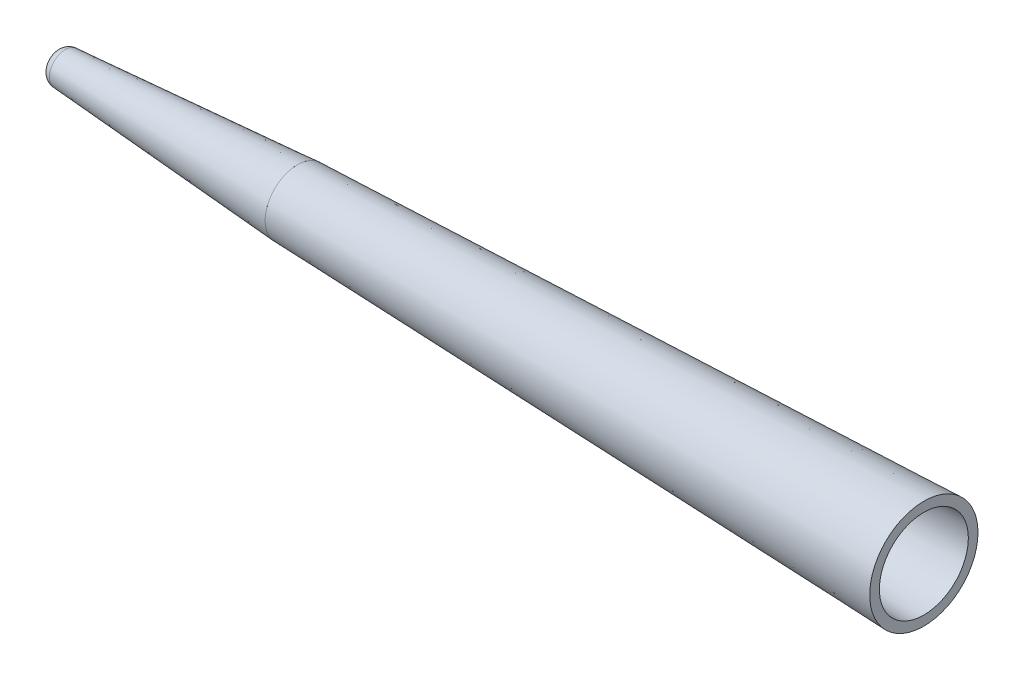
ISO-10303-21;
HEADER;
FILE_DESCRIPTION(('STEP AP214'),'2;1');
FILE_NAME('part.step','',(''),(''),'','','');
FILE_SCHEMA(('AUTOMOTIVE_DESIGN { 1 0 10303 214 1 1 1 1 }'));
ENDSEC;
DATA;
#1=APPLICATION_CONTEXT('core data for automotive mechanical design processes');
#2=APPLICATION_PROTOCOL_DEFINITION('international standard','automotive_design',2000,#1);
#3=PRODUCT_CONTEXT('',#1,'mechanical');
#4=PRODUCT('Part','Part','',(#3));
#5=PRODUCT_RELATED_PRODUCT_CATEGORY('part','',(#4));
#6=PRODUCT_DEFINITION_FORMATION('','',#4);
#7=PRODUCT_DEFINITION_CONTEXT('part definition',#1,'design');
#8=PRODUCT_DEFINITION('design','',#6,#7);
#9=PRODUCT_DEFINITION_SHAPE('','',#8);
#10=(LENGTH_UNIT() NAMED_UNIT(*) SI_UNIT(.MILLI.,.METRE.));
#11=(NAMED_UNIT(*) PLANE_ANGLE_UNIT() SI_UNIT($,.RADIAN.));
#12=(NAMED_UNIT(*) SI_UNIT($,.STERADIAN.) SOLID_ANGLE_UNIT());
#13=UNCERTAINTY_MEASURE_WITH_UNIT(LENGTH_MEASURE(1.E-05),#10,'distance_accuracy_value','');
#14=(GEOMETRIC_REPRESENTATION_CONTEXT(3) GLOBAL_UNCERTAINTY_ASSIGNED_CONTEXT((#13)) GLOBAL_UNIT_ASSIGNED_CONTEXT((#10,
#11,#12)) REPRESENTATION_CONTEXT('',''));
#15=CARTESIAN_POINT('',(0.,0.,0.));
#16=DIRECTION('',(0.,0.,1.));
#17=DIRECTION('',(1.,0.,0.));
#18=AXIS2_PLACEMENT_3D('',#15,#16,#17);
#19=CARTESIAN_POINT('',(50.,6.69634059717554,0.));
#20=DIRECTION('',(-1.,0.,0.));
#21=DIRECTION('',(0.,0.,1.));
#22=AXIS2_PLACEMENT_3D('',#19,#20,#21);
#23=PLANE('',#22);
#24=CARTESIAN_POINT('',(50.,0.,0.));
#25=DIRECTION('',(1.,0.,0.));
#26=DIRECTION('',(0.,0.,-1.));
#27=AXIS2_PLACEMENT_3D('',#24,#25,#26);
#28=CIRCLE('',#27,4.69512150857789);
#29=CARTESIAN_POINT('',(50.,0.,-4.69512150857789));
#30=VERTEX_POINT('',#29);
#31=EDGE_CURVE('E11',#30,#30,#28,.T.);
#32=ORIENTED_EDGE('',*,*,#31,.T.);
#33=EDGE_LOOP('',(#32));
#34=FACE_BOUND('',#33,.T.);
#35=CARTESIAN_POINT('',(50.,0.,0.));
#36=DIRECTION('',(1.,0.,0.));
#37=DIRECTION('',(0.,0.,-1.));
#38=AXIS2_PLACEMENT_3D('',#35,#36,#37);
#39=CIRCLE('',#38,6.69634059717554);
#40=CARTESIAN_POINT('',(50.,0.,-6.69634059717554));
#41=VERTEX_POINT('',#40);
#42=EDGE_CURVE('E68',#41,#41,#39,.T.);
#43=ORIENTED_EDGE('',*,*,#42,.F.);
#44=EDGE_LOOP('',(#43));
#45=FACE_BOUND('',#44,.T.);
#46=ADVANCED_FACE('F51',(#34,#45),#23,.T.);
#47=CARTESIAN_POINT('',(50.,0.,0.));
#48=DIRECTION('',(1.,0.,0.));
#49=DIRECTION('',(0.,0.,-1.));
#50=AXIS2_PLACEMENT_3D('',#47,#48,#49);
#51=CONICAL_SURFACE('',#50,4.69512150857789,0.0349065850398873);
#52=CARTESIAN_POINT('',(180.,0.,0.));
#53=DIRECTION('',(1.,0.,0.));
#54=DIRECTION('',(0.,0.,-1.));
#55=AXIS2_PLACEMENT_3D('',#52,#53,#54);
#56=CIRCLE('',#55,9.2348215425052);
#57=CARTESIAN_POINT('',(180.,0.,-9.2348215425052));
#58=VERTEX_POINT('',#57);
#59=EDGE_CURVE('E58',#58,#58,#56,.T.);
#60=ORIENTED_EDGE('',*,*,#59,.T.);
#61=EDGE_LOOP('',(#60));
#62=FACE_BOUND('',#61,.T.);
#63=ORIENTED_EDGE('',*,*,#31,.F.);
#64=EDGE_LOOP('',(#63));
#65=FACE_BOUND('',#64,.T.);
#66=ADVANCED_FACE('F79',(#62,#65),#51,.F.);
#67=CARTESIAN_POINT('',(180.,9.2348215425052,0.));
#68=DIRECTION('',(1.,0.,0.));
#69=DIRECTION('',(0.,0.,-1.));
#70=AXIS2_PLACEMENT_3D('',#67,#68,#69);
#71=PLANE('',#70);
#72=CARTESIAN_POINT('',(180.,0.,0.));
#73=DIRECTION('',(1.,0.,0.));
#74=DIRECTION('',(0.,0.,-1.));
#75=AXIS2_PLACEMENT_3D('',#72,#73,#74);
#76=CIRCLE('',#75,11.2360406311028);
#77=CARTESIAN_POINT('',(180.,0.,-11.2360406311028));
#78=VERTEX_POINT('',#77);
#79=EDGE_CURVE('E63',#78,#78,#76,.T.);
#80=ORIENTED_EDGE('',*,*,#79,.T.);
#81=EDGE_LOOP('',(#80));
#82=FACE_BOUND('',#81,.T.);
#83=ORIENTED_EDGE('',*,*,#59,.F.);
#84=EDGE_LOOP('',(#83));
#85=FACE_BOUND('',#84,.T.);
#86=ADVANCED_FACE('F83',(#82,#85),#71,.T.);
#87=CARTESIAN_POINT('',(180.,0.,0.));
#88=DIRECTION('',(1.,0.,0.));
#89=DIRECTION('',(0.,0.,-1.));
#90=AXIS2_PLACEMENT_3D('',#87,#88,#89);
#91=CONICAL_SURFACE('',#90,11.2360406311028,0.0349065850398873);
#92=ORIENTED_EDGE('',*,*,#42,.T.);
#93=EDGE_LOOP('',(#92));
#94=FACE_BOUND('',#93,.T.);
#95=ORIENTED_EDGE('',*,*,#79,.F.);
#96=EDGE_LOOP('',(#95));
#97=FACE_BOUND('',#96,.T.);
#98=ADVANCED_FACE('F75',(#94,#97),#91,.T.);
#99=CLOSED_SHELL('',(#46,#66,#86,#98));
#100=MANIFOLD_SOLID_BREP('B2',#99);
#101=CARTESIAN_POINT('',(1.99026806874157,0.,0.));
#102=DIRECTION('',(-1.,0.,0.));
#103=DIRECTION('',(0.,0.,1.));
#104=AXIS2_PLACEMENT_3D('',#101,#102,#103);
#105=DEGENERATE_TOROIDAL_SURFACE('',#104,1.33917310096007,1.99512810051965,.T.);
#106=CARTESIAN_POINT('',(0.,0.,0.));
#107=DIRECTION('',(-1.,0.,0.));
#108=DIRECTION('',(0.,0.,1.));
#109=AXIS2_PLACEMENT_3D('',#106,#107,#108);
#110=CIRCLE('',#109,1.2);
#111=CARTESIAN_POINT('',(0.,0.,-1.2));
#112=VERTEX_POINT('',#111);
#113=EDGE_CURVE('E139',#112,#112,#110,.T.);
#114=ORIENTED_EDGE('',*,*,#113,.F.);
#115=EDGE_LOOP('',(#114));
#116=FACE_BOUND('',#115,.T.);
#117=CARTESIAN_POINT('',(1.85109496778151,0.,0.));
#118=DIRECTION('',(-1.,0.,0.));
#119=DIRECTION('',(0.,0.,1.));
#120=AXIS2_PLACEMENT_3D('',#117,#118,#119);
#121=CIRCLE('',#120,3.32944116970164);
#122=CARTESIAN_POINT('',(1.85109496778151,0.,3.32944116970164));
#123=VERTEX_POINT('',#122);
#124=EDGE_CURVE('E50',#123,#123,#121,.T.);
#125=ORIENTED_EDGE('',*,*,#124,.T.);
#126=EDGE_LOOP('',(#125));
#127=FACE_BOUND('',#126,.T.);
#128=ADVANCED_FACE('F125',(#116,#127),#105,.T.);
#129=CARTESIAN_POINT('',(50.,0.,0.));
#130=DIRECTION('',(1.,0.,0.));
#131=DIRECTION('',(0.,0.,-1.));
#132=AXIS2_PLACEMENT_3D('',#129,#130,#131);
#133=CONICAL_SURFACE('',#132,6.69634059717554,0.0698131700797735);
#134=ORIENTED_EDGE('',*,*,#124,.F.);
#135=EDGE_LOOP('',(#134));
#136=FACE_BOUND('',#135,.T.);
#137=CARTESIAN_POINT('',(50.,0.,0.));
#138=DIRECTION('',(-1.,0.,0.));
#139=DIRECTION('',(0.,0.,1.));
#140=AXIS2_PLACEMENT_3D('',#137,#138,#139);
#141=CIRCLE('',#140,6.69634059717554);
#142=CARTESIAN_POINT('',(50.,0.,6.69634059717554));
#143=VERTEX_POINT('',#142);
#144=EDGE_CURVE('E131',#143,#143,#141,.T.);
#145=ORIENTED_EDGE('',*,*,#144,.T.);
#146=EDGE_LOOP('',(#145));
#147=FACE_BOUND('',#146,.T.);
#148=ADVANCED_FACE('F148',(#136,#147),#133,.T.);
#149=CARTESIAN_POINT('',(50.,6.69634059717554,0.));
#150=DIRECTION('',(-1.,0.,0.));
#151=DIRECTION('',(0.,0.,1.));
#152=AXIS2_PLACEMENT_3D('',#149,#150,#151);
#153=PLANE('',#152);
#154=ORIENTED_EDGE('',*,*,#144,.F.);
#155=EDGE_LOOP('',(#154));
#156=FACE_BOUND('',#155,.T.);
#157=CARTESIAN_POINT('',(50.,0.,0.));
#158=DIRECTION('',(-1.,0.,0.));
#159=DIRECTION('',(0.,0.,1.));
#160=AXIS2_PLACEMENT_3D('',#157,#158,#159);
#161=CIRCLE('',#160,4.69634059717554);
#162=CARTESIAN_POINT('',(50.,0.,-4.69634059717554));
#163=VERTEX_POINT('',#162);
#164=EDGE_CURVE('E135',#163,#163,#161,.T.);
#165=ORIENTED_EDGE('',*,*,#164,.T.);
#166=EDGE_LOOP('',(#165));
#167=FACE_BOUND('',#166,.T.);
#168=ADVANCED_FACE('F152',(#156,#167),#153,.F.);
#169=CARTESIAN_POINT('',(0.,0.,0.));
#170=DIRECTION('',(1.,0.,0.));
#171=DIRECTION('',(0.,0.,-1.));
#172=AXIS2_PLACEMENT_3D('',#169,#170,#171);
#173=CONICAL_SURFACE('',#172,1.2,0.0698131700797735);
#174=CARTESIAN_POINT('',(50.,0.,-4.69634059717554));
#175=CARTESIAN_POINT('',(49.4791666666667,0.,-4.65992038262162));
#176=CARTESIAN_POINT('',(48.9583333333333,0.,-4.62350016806771));
#177=CARTESIAN_POINT('',(47.9166666666667,0.,-4.55065973895989));
#178=CARTESIAN_POINT('',(47.3958333333333,0.,-4.51423952440598));
#179=CARTESIAN_POINT('',(46.3541666666667,0.,-4.44139909529815));
#180=CARTESIAN_POINT('',(45.8333333333333,0.,-4.40497888074424));
#181=CARTESIAN_POINT('',(44.7916666666667,0.,-4.33213845163642));
#182=CARTESIAN_POINT('',(44.2708333333333,0.,-4.29571823708251));
#183=CARTESIAN_POINT('',(43.2291666666667,0.,-4.22287780797468));
#184=CARTESIAN_POINT('',(42.7083333333333,0.,-4.18645759342077));
#185=CARTESIAN_POINT('',(41.6666666666667,0.,-4.11361716431295));
#186=CARTESIAN_POINT('',(41.1458333333333,0.,-4.07719694975904));
#187=CARTESIAN_POINT('',(40.1041666666667,0.,-4.00435652065121));
#188=CARTESIAN_POINT('',(39.5833333333333,0.,-3.9679363060973));
#189=CARTESIAN_POINT('',(38.5416666666667,0.,-3.89509587698948));
#190=CARTESIAN_POINT('',(38.0208333333333,0.,-3.85867566243556));
#191=CARTESIAN_POINT('',(36.9791666666667,0.,-3.78583523332774));
#192=CARTESIAN_POINT('',(36.4583333333333,0.,-3.74941501877383));
#193=CARTESIAN_POINT('',(35.4166666666667,0.,-3.67657458966601));
#194=CARTESIAN_POINT('',(34.8958333333333,0.,-3.64015437511209));
#195=CARTESIAN_POINT('',(33.8541666666667,0.,-3.56731394600427));
#196=CARTESIAN_POINT('',(33.3333333333333,0.,-3.53089373145036));
#197=CARTESIAN_POINT('',(32.2916666666667,0.,-3.45805330234253));
#198=CARTESIAN_POINT('',(31.7708333333333,0.,-3.42163308778862));
#199=CARTESIAN_POINT('',(30.7291666666667,0.,-3.3487926586808));
#200=CARTESIAN_POINT('',(30.2083333333333,0.,-3.31237244412689));
#201=CARTESIAN_POINT('',(29.1666666666667,0.,-3.23953201501906));
#202=CARTESIAN_POINT('',(28.6458333333333,0.,-3.20311180046515));
#203=CARTESIAN_POINT('',(27.6041666666667,0.,-3.13027137135733));
#204=CARTESIAN_POINT('',(27.0833333333333,0.,-3.09385115680342));
#205=CARTESIAN_POINT('',(26.0416666666667,0.,-3.02101072769559));
#206=CARTESIAN_POINT('',(25.5208333333333,0.,-2.98459051314168));
#207=CARTESIAN_POINT('',(24.4791666666667,0.,-2.91175008403386));
#208=CARTESIAN_POINT('',(23.9583333333333,0.,-2.87532986947995));
#209=CARTESIAN_POINT('',(22.9166666666667,0.,-2.80248944037212));
#210=CARTESIAN_POINT('',(22.3958333333333,0.,-2.76606922581821));
#211=CARTESIAN_POINT('',(21.3541666666667,0.,-2.69322879671039));
#212=CARTESIAN_POINT('',(20.8333333333333,0.,-2.65680858215647));
#213=CARTESIAN_POINT('',(19.7916666666667,0.,-2.58396815304865));
#214=CARTESIAN_POINT('',(19.2708333333333,0.,-2.54754793849474));
#215=CARTESIAN_POINT('',(18.2291666666667,0.,-2.47470750938691));
#216=CARTESIAN_POINT('',(17.7083333333333,0.,-2.438287294833));
#217=CARTESIAN_POINT('',(16.6666666666667,0.,-2.36544686572518));
#218=CARTESIAN_POINT('',(16.1458333333333,0.,-2.32902665117127));
#219=CARTESIAN_POINT('',(15.1041666666667,0.,-2.25618622206344));
#220=CARTESIAN_POINT('',(14.5833333333333,0.,-2.21976600750953));
#221=CARTESIAN_POINT('',(13.5416666666667,0.,-2.14692557840171));
#222=CARTESIAN_POINT('',(13.0208333333333,0.,-2.1105053638478));
#223=CARTESIAN_POINT('',(11.9791666666667,0.,-2.03766493473997));
#224=CARTESIAN_POINT('',(11.4583333333333,0.,-2.00124472018606));
#225=CARTESIAN_POINT('',(10.4166666666667,0.,-1.92840429107824));
#226=CARTESIAN_POINT('',(9.89583333333334,0.,-1.89198407652432));
#227=CARTESIAN_POINT('',(8.85416666666667,0.,-1.8191436474165));
#228=CARTESIAN_POINT('',(8.33333333333334,0.,-1.78272343286259));
#229=CARTESIAN_POINT('',(7.29166666666667,0.,-1.70988300375477));
#230=CARTESIAN_POINT('',(6.77083333333334,0.,-1.67346278920085));
#231=CARTESIAN_POINT('',(5.72916666666667,0.,-1.60062236009303));
#232=CARTESIAN_POINT('',(5.20833333333333,0.,-1.56420214553912));
#233=CARTESIAN_POINT('',(4.16666666666667,0.,-1.49136171643129));
#234=CARTESIAN_POINT('',(3.64583333333334,0.,-1.45494150187738));
#235=CARTESIAN_POINT('',(2.60416666666667,0.,-1.38210107276956));
#236=CARTESIAN_POINT('',(2.08333333333334,0.,-1.34568085821565));
#237=CARTESIAN_POINT('',(1.04166666666667,0.,-1.27284042910782));
#238=CARTESIAN_POINT('',(0.520833333333338,0.,-1.23642021455391));
#239=CARTESIAN_POINT('',(0.,0.,-1.2));
#240=B_SPLINE_CURVE_WITH_KNOTS('',3,(#174,#175,#176,#177,#178,#179,#180,#181,#182,#183,#184,
#185,#186,#187,#188,#189,#190,#191,#192,#193,#194,#195,#196,#197,#198,#199,#200,#201,#202,#203,
#204,#205,#206,#207,#208,#209,#210,#211,#212,#213,#214,#215,#216,#217,#218,#219,#220,#221,#222,
#223,#224,#225,#226,#227,#228,#229,#230,#231,#232,#233,#234,#235,#236,#237,#238,#239),
.UNSPECIFIED.,.F.,.F.,(4,2,2,2,2,2,2,2,2,2,2,2,2,2,2,2,2,2,2,2,2,2,2,2,2,2,2,2,2,2,2,2,4),(0.,
1.56631546575183,3.13263093150367,4.69894639725549,6.26526186300732,7.83157732875916,
9.39789279451098,10.9642082602628,12.5305237260147,14.0968391917665,15.6631546575183,
17.2294701232701,18.795785589022,20.3621010547738,21.9284165205256,23.4947319862775,
25.0610474520293,26.6273629177811,28.193678383533,29.7599938492848,31.3263093150366,
32.8926247807885,34.4589402465403,36.0252557122921,37.5915711780439,39.1578866437958,
40.7242021095476,42.2905175752994,43.8568330410513,45.4231485068031,46.9894639725549,
48.5557794383068,50.1220949040586),.UNSPECIFIED.);
#241=EDGE_CURVE('BSEAM145',#163,#112,#240,.T.);
#242=ORIENTED_EDGE('',*,*,#164,.F.);
#243=ORIENTED_EDGE('',*,*,#113,.T.);
#244=ORIENTED_EDGE('',*,*,#241,.T.);
#245=ORIENTED_EDGE('',*,*,#241,.F.);
#246=EDGE_LOOP('',(#242,#244,#243,#245));
#247=FACE_BOUND('',#246,.T.);
#248=ADVANCED_FACE('F145',(#247),#173,.F.);
#249=CLOSED_SHELL('',(#128,#148,#168,#248));
#250=MANIFOLD_SOLID_BREP('B6',#249);
#251=ADVANCED_BREP_SHAPE_REPRESENTATION('',(#18,#100,#250),#14);
#252=SHAPE_DEFINITION_REPRESENTATION(#9,#251);
ENDSEC;
END-ISO-10303-21;
